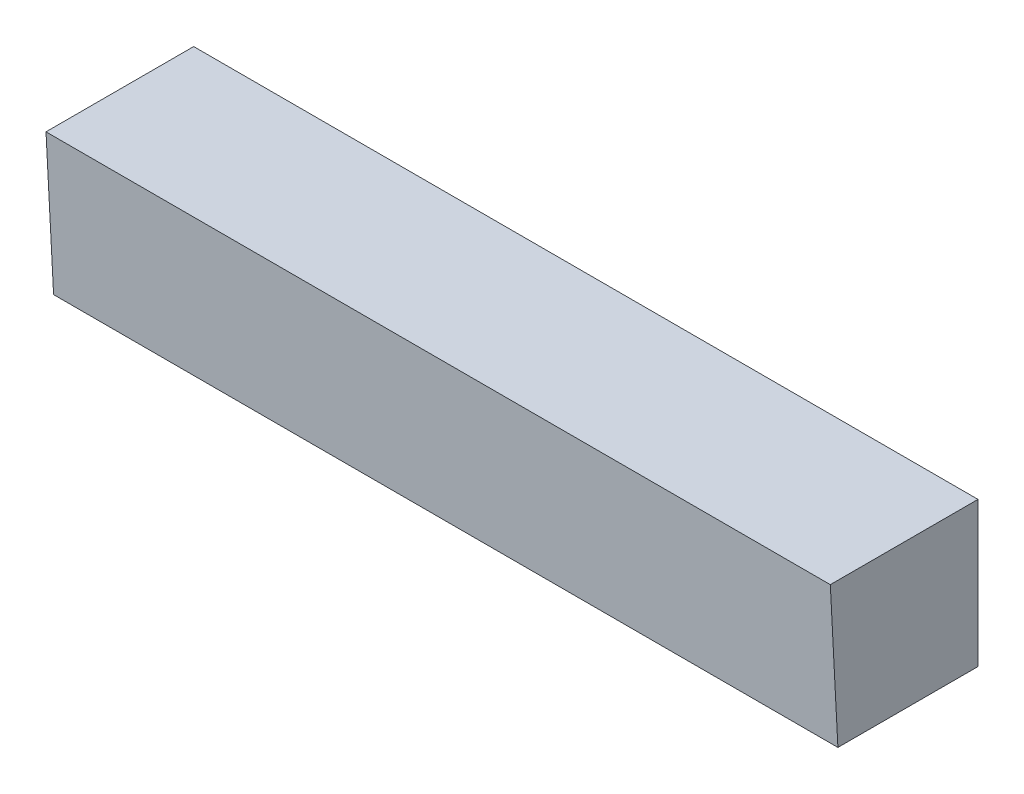
ISO-10303-21;
HEADER;
FILE_DESCRIPTION(('STEP AP214'),'2;1');
FILE_NAME('part.step','',(''),(''),'','','');
FILE_SCHEMA(('AUTOMOTIVE_DESIGN { 1 0 10303 214 1 1 1 1 }'));
ENDSEC;
DATA;
#1=APPLICATION_CONTEXT('core data for automotive mechanical design processes');
#2=APPLICATION_PROTOCOL_DEFINITION('international standard','automotive_design',2000,#1);
#3=PRODUCT_CONTEXT('',#1,'mechanical');
#4=PRODUCT('Part','Part','',(#3));
#5=PRODUCT_RELATED_PRODUCT_CATEGORY('part','',(#4));
#6=PRODUCT_DEFINITION_FORMATION('','',#4);
#7=PRODUCT_DEFINITION_CONTEXT('part definition',#1,'design');
#8=PRODUCT_DEFINITION('design','',#6,#7);
#9=PRODUCT_DEFINITION_SHAPE('','',#8);
#10=(LENGTH_UNIT() NAMED_UNIT(*) SI_UNIT(.MILLI.,.METRE.));
#11=(NAMED_UNIT(*) PLANE_ANGLE_UNIT() SI_UNIT($,.RADIAN.));
#12=(NAMED_UNIT(*) SI_UNIT($,.STERADIAN.) SOLID_ANGLE_UNIT());
#13=UNCERTAINTY_MEASURE_WITH_UNIT(LENGTH_MEASURE(1.E-05),#10,'distance_accuracy_value','');
#14=(GEOMETRIC_REPRESENTATION_CONTEXT(3) GLOBAL_UNCERTAINTY_ASSIGNED_CONTEXT((#13)) GLOBAL_UNIT_ASSIGNED_CONTEXT((#10,
#11,#12)) REPRESENTATION_CONTEXT('',''));
#15=CARTESIAN_POINT('',(0.,0.,0.));
#16=DIRECTION('',(0.,0.,1.));
#17=DIRECTION('',(1.,0.,0.));
#18=AXIS2_PLACEMENT_3D('',#15,#16,#17);
#19=CARTESIAN_POINT('',(80.,-28.,-107.));
#20=DIRECTION('',(0.,-1.,0.));
#21=DIRECTION('',(1.,0.,0.));
#22=AXIS2_PLACEMENT_3D('',#19,#20,#21);
#23=PLANE('',#22);
#24=DIRECTION('',(0.,0.,1.));
#25=VECTOR('',#24,1.);
#26=CARTESIAN_POINT('',(15.,-28.,-107.));
#27=LINE('',#26,#25);
#28=CARTESIAN_POINT('',(15.,-28.,-107.));
#29=VERTEX_POINT('',#28);
#30=CARTESIAN_POINT('',(15.,-28.,-94.7605805656528));
#31=VERTEX_POINT('',#30);
#32=EDGE_CURVE('E99',#29,#31,#27,.T.);
#33=ORIENTED_EDGE('',*,*,#32,.T.);
#34=DIRECTION('',(-1.,0.,0.));
#35=VECTOR('',#34,1.);
#36=CARTESIAN_POINT('',(80.,-28.,-94.7605805656528));
#37=LINE('',#36,#35);
#38=CARTESIAN_POINT('',(80.,-28.,-94.7605805656528));
#39=VERTEX_POINT('',#38);
#40=EDGE_CURVE('E11',#39,#31,#37,.T.);
#41=ORIENTED_EDGE('',*,*,#40,.F.);
#42=DIRECTION('',(0.,0.,1.));
#43=VECTOR('',#42,1.);
#44=CARTESIAN_POINT('',(80.,-28.,-107.));
#45=LINE('',#44,#43);
#46=CARTESIAN_POINT('',(80.,-28.,-107.));
#47=VERTEX_POINT('',#46);
#48=EDGE_CURVE('E87',#47,#39,#45,.T.);
#49=ORIENTED_EDGE('',*,*,#48,.F.);
#50=DIRECTION('',(-1.,0.,0.));
#51=VECTOR('',#50,1.);
#52=CARTESIAN_POINT('',(80.,-28.,-107.));
#53=LINE('',#52,#51);
#54=EDGE_CURVE('E95',#47,#29,#53,.T.);
#55=ORIENTED_EDGE('',*,*,#54,.T.);
#56=EDGE_LOOP('',(#33,#41,#49,#55));
#57=FACE_BOUND('',#56,.T.);
#58=ADVANCED_FACE('F36',(#57),#23,.F.);
#59=CARTESIAN_POINT('',(80.,-28.,-94.7605805656528));
#60=DIRECTION('',(0.,0.0523359562429478,-0.998629534754574));
#61=DIRECTION('',(0.,0.998629534754574,0.0523359562429478));
#62=AXIS2_PLACEMENT_3D('',#59,#60,#61);
#63=PLANE('',#62);
#64=DIRECTION('',(0.,-0.998629534754574,-0.0523359562429478));
#65=VECTOR('',#64,1.);
#66=CARTESIAN_POINT('',(15.,-28.,-94.7605805656528));
#67=LINE('',#66,#65);
#68=CARTESIAN_POINT('',(15.,-40.,-95.3894739170494));
#69=VERTEX_POINT('',#68);
#70=EDGE_CURVE('E91',#31,#69,#67,.T.);
#71=ORIENTED_EDGE('',*,*,#70,.T.);
#72=DIRECTION('',(-1.,0.,0.));
#73=VECTOR('',#72,1.);
#74=CARTESIAN_POINT('',(80.,-40.,-95.3894739170494));
#75=LINE('',#74,#73);
#76=CARTESIAN_POINT('',(80.,-40.,-95.3894739170494));
#77=VERTEX_POINT('',#76);
#78=EDGE_CURVE('E44',#77,#69,#75,.T.);
#79=ORIENTED_EDGE('',*,*,#78,.F.);
#80=DIRECTION('',(0.,-0.998629534754574,-0.0523359562429478));
#81=VECTOR('',#80,1.);
#82=CARTESIAN_POINT('',(80.,-28.,-94.7605805656528));
#83=LINE('',#82,#81);
#84=EDGE_CURVE('E82',#39,#77,#83,.T.);
#85=ORIENTED_EDGE('',*,*,#84,.F.);
#86=ORIENTED_EDGE('',*,*,#40,.T.);
#87=EDGE_LOOP('',(#71,#79,#85,#86));
#88=FACE_BOUND('',#87,.T.);
#89=ADVANCED_FACE('F90',(#88),#63,.F.);
#90=CARTESIAN_POINT('',(80.,-40.,-95.3894739170494));
#91=DIRECTION('',(0.,1.,0.));
#92=DIRECTION('',(-1.,0.,0.));
#93=AXIS2_PLACEMENT_3D('',#90,#91,#92);
#94=PLANE('',#93);
#95=DIRECTION('',(0.,0.,-1.));
#96=VECTOR('',#95,1.);
#97=CARTESIAN_POINT('',(15.,-40.,-95.3894739170494));
#98=LINE('',#97,#96);
#99=CARTESIAN_POINT('',(15.,-40.,-107.));
#100=VERTEX_POINT('',#99);
#101=EDGE_CURVE('E69',#69,#100,#98,.T.);
#102=ORIENTED_EDGE('',*,*,#101,.T.);
#103=DIRECTION('',(-1.,0.,0.));
#104=VECTOR('',#103,1.);
#105=CARTESIAN_POINT('',(80.,-40.,-107.));
#106=LINE('',#105,#104);
#107=CARTESIAN_POINT('',(80.,-40.,-107.));
#108=VERTEX_POINT('',#107);
#109=EDGE_CURVE('E92',#108,#100,#106,.T.);
#110=ORIENTED_EDGE('',*,*,#109,.F.);
#111=DIRECTION('',(0.,0.,-1.));
#112=VECTOR('',#111,1.);
#113=CARTESIAN_POINT('',(80.,-40.,-95.3894739170494));
#114=LINE('',#113,#112);
#115=EDGE_CURVE('E85',#77,#108,#114,.T.);
#116=ORIENTED_EDGE('',*,*,#115,.F.);
#117=ORIENTED_EDGE('',*,*,#78,.T.);
#118=EDGE_LOOP('',(#102,#110,#116,#117));
#119=FACE_BOUND('',#118,.T.);
#120=ADVANCED_FACE('F93',(#119),#94,.F.);
#121=CARTESIAN_POINT('',(80.,-40.,-107.));
#122=DIRECTION('',(0.,0.,1.));
#123=DIRECTION('',(1.,0.,0.));
#124=AXIS2_PLACEMENT_3D('',#121,#122,#123);
#125=PLANE('',#124);
#126=DIRECTION('',(0.,1.,0.));
#127=VECTOR('',#126,1.);
#128=CARTESIAN_POINT('',(15.,-40.,-107.));
#129=LINE('',#128,#127);
#130=EDGE_CURVE('E75',#100,#29,#129,.T.);
#131=ORIENTED_EDGE('',*,*,#130,.T.);
#132=ORIENTED_EDGE('',*,*,#54,.F.);
#133=DIRECTION('',(0.,1.,0.));
#134=VECTOR('',#133,1.);
#135=CARTESIAN_POINT('',(80.,-40.,-107.));
#136=LINE('',#135,#134);
#137=EDGE_CURVE('E52',#108,#47,#136,.T.);
#138=ORIENTED_EDGE('',*,*,#137,.F.);
#139=ORIENTED_EDGE('',*,*,#109,.T.);
#140=EDGE_LOOP('',(#131,#132,#138,#139));
#141=FACE_BOUND('',#140,.T.);
#142=ADVANCED_FACE('F106',(#141),#125,.F.);
#143=CARTESIAN_POINT('',(80.,0.,0.));
#144=DIRECTION('',(-1.,0.,0.));
#145=DIRECTION('',(0.,-1.,0.));
#146=AXIS2_PLACEMENT_3D('',#143,#144,#145);
#147=PLANE('',#146);
#148=ORIENTED_EDGE('',*,*,#48,.T.);
#149=ORIENTED_EDGE('',*,*,#84,.T.);
#150=ORIENTED_EDGE('',*,*,#115,.T.);
#151=ORIENTED_EDGE('',*,*,#137,.T.);
#152=EDGE_LOOP('',(#148,#149,#150,#151));
#153=FACE_BOUND('',#152,.T.);
#154=ADVANCED_FACE('F83',(#153),#147,.F.);
#155=CARTESIAN_POINT('',(15.,0.,0.));
#156=DIRECTION('',(-1.,0.,0.));
#157=DIRECTION('',(0.,-1.,0.));
#158=AXIS2_PLACEMENT_3D('',#155,#156,#157);
#159=PLANE('',#158);
#160=ORIENTED_EDGE('',*,*,#32,.F.);
#161=ORIENTED_EDGE('',*,*,#130,.F.);
#162=ORIENTED_EDGE('',*,*,#101,.F.);
#163=ORIENTED_EDGE('',*,*,#70,.F.);
#164=EDGE_LOOP('',(#160,#161,#162,#163));
#165=FACE_BOUND('',#164,.T.);
#166=ADVANCED_FACE('F109',(#165),#159,.T.);
#167=CLOSED_SHELL('',(#58,#89,#120,#142,#154,#166));
#168=MANIFOLD_SOLID_BREP('B2',#167);
#169=ADVANCED_BREP_SHAPE_REPRESENTATION('',(#18,#168),#14);
#170=SHAPE_DEFINITION_REPRESENTATION(#9,#169);
ENDSEC;
END-ISO-10303-21;
